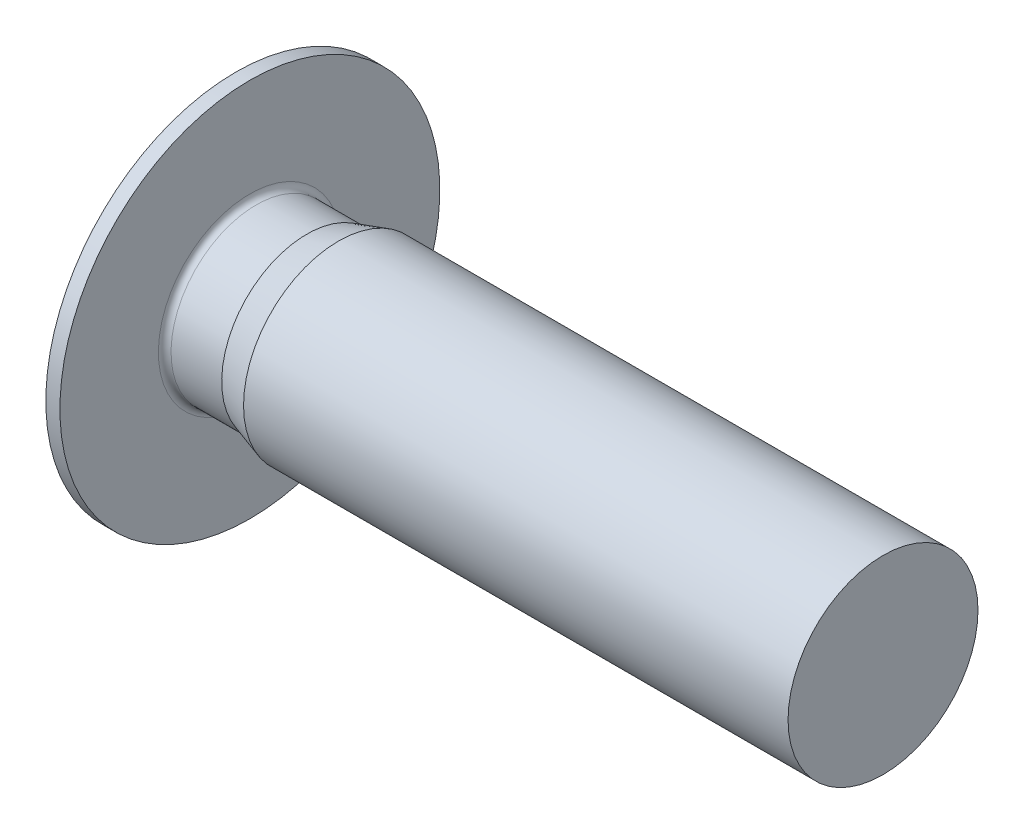
ISO-10303-21;
HEADER;
FILE_DESCRIPTION(('STEP AP214'),'2;1');
FILE_NAME('part.step','',(''),(''),'','','');
FILE_SCHEMA(('AUTOMOTIVE_DESIGN { 1 0 10303 214 1 1 1 1 }'));
ENDSEC;
DATA;
#1=APPLICATION_CONTEXT('core data for automotive mechanical design processes');
#2=APPLICATION_PROTOCOL_DEFINITION('international standard','automotive_design',2000,#1);
#3=PRODUCT_CONTEXT('',#1,'mechanical');
#4=PRODUCT('Part','Part','',(#3));
#5=PRODUCT_RELATED_PRODUCT_CATEGORY('part','',(#4));
#6=PRODUCT_DEFINITION_FORMATION('','',#4);
#7=PRODUCT_DEFINITION_CONTEXT('part definition',#1,'design');
#8=PRODUCT_DEFINITION('design','',#6,#7);
#9=PRODUCT_DEFINITION_SHAPE('','',#8);
#10=(LENGTH_UNIT() NAMED_UNIT(*) SI_UNIT(.MILLI.,.METRE.));
#11=(NAMED_UNIT(*) PLANE_ANGLE_UNIT() SI_UNIT($,.RADIAN.));
#12=(NAMED_UNIT(*) SI_UNIT($,.STERADIAN.) SOLID_ANGLE_UNIT());
#13=UNCERTAINTY_MEASURE_WITH_UNIT(LENGTH_MEASURE(1.E-05),#10,'distance_accuracy_value','');
#14=(GEOMETRIC_REPRESENTATION_CONTEXT(3) GLOBAL_UNCERTAINTY_ASSIGNED_CONTEXT((#13)) GLOBAL_UNIT_ASSIGNED_CONTEXT((#10,
#11,#12)) REPRESENTATION_CONTEXT('',''));
#15=CARTESIAN_POINT('',(0.,0.,0.));
#16=DIRECTION('',(0.,0.,1.));
#17=DIRECTION('',(1.,0.,0.));
#18=AXIS2_PLACEMENT_3D('',#15,#16,#17);
#19=CARTESIAN_POINT('',(1.2,0.,0.));
#20=DIRECTION('',(-1.,0.,0.));
#21=DIRECTION('',(0.,0.,1.));
#22=AXIS2_PLACEMENT_3D('',#19,#20,#21);
#23=PLANE('',#22);
#24=CARTESIAN_POINT('',(1.2,0.,0.));
#25=DIRECTION('',(-1.,0.,0.));
#26=DIRECTION('',(0.,-1.,0.));
#27=AXIS2_PLACEMENT_3D('',#24,#25,#26);
#28=CIRCLE('',#27,0.75);
#29=CARTESIAN_POINT('',(1.2,-0.649519052838329,0.375));
#30=VERTEX_POINT('',#29);
#31=CARTESIAN_POINT('',(1.2,0.,0.75));
#32=VERTEX_POINT('',#31);
#33=EDGE_CURVE('E58',#30,#32,#28,.T.);
#34=ORIENTED_EDGE('',*,*,#33,.F.);
#35=DIRECTION('',(0.,0.5,0.866025403784439));
#36=VECTOR('',#35,1.);
#37=CARTESIAN_POINT('',(1.2,-0.866025403784439,0.));
#38=LINE('',#37,#36);
#39=CARTESIAN_POINT('',(1.2,-0.43301270189222,0.75));
#40=VERTEX_POINT('',#39);
#41=EDGE_CURVE('E309',#30,#40,#38,.T.);
#42=ORIENTED_EDGE('',*,*,#41,.T.);
#43=DIRECTION('',(0.,1.,0.));
#44=VECTOR('',#43,1.);
#45=CARTESIAN_POINT('',(1.2,-0.43301270189222,0.75));
#46=LINE('',#45,#44);
#47=EDGE_CURVE('E261',#40,#32,#46,.T.);
#48=ORIENTED_EDGE('',*,*,#47,.T.);
#49=EDGE_LOOP('',(#34,#42,#48));
#50=FACE_BOUND('',#49,.T.);
#51=ADVANCED_FACE('F46',(#50),#23,.T.);
#52=CARTESIAN_POINT('',(1.2,0.649519052838329,0.375));
#53=VERTEX_POINT('',#52);
#54=EDGE_CURVE('E11',#32,#53,#28,.T.);
#55=ORIENTED_EDGE('',*,*,#54,.F.);
#56=CARTESIAN_POINT('',(1.2,0.43301270189222,0.75));
#57=VERTEX_POINT('',#56);
#58=EDGE_CURVE('E298',#32,#57,#46,.T.);
#59=ORIENTED_EDGE('',*,*,#58,.T.);
#60=DIRECTION('',(0.,0.5,-0.866025403784439));
#61=VECTOR('',#60,1.);
#62=CARTESIAN_POINT('',(1.2,0.43301270189222,0.75));
#63=LINE('',#62,#61);
#64=EDGE_CURVE('E328',#57,#53,#63,.T.);
#65=ORIENTED_EDGE('',*,*,#64,.T.);
#66=EDGE_LOOP('',(#55,#59,#65));
#67=FACE_BOUND('',#66,.T.);
#68=ADVANCED_FACE('F134',(#67),#23,.T.);
#69=CARTESIAN_POINT('',(1.2,0.649519052838329,-0.375));
#70=VERTEX_POINT('',#69);
#71=EDGE_CURVE('E56',#53,#70,#28,.T.);
#72=ORIENTED_EDGE('',*,*,#71,.F.);
#73=CARTESIAN_POINT('',(1.2,0.866025403784439,0.));
#74=VERTEX_POINT('',#73);
#75=EDGE_CURVE('E278',#53,#74,#63,.T.);
#76=ORIENTED_EDGE('',*,*,#75,.T.);
#77=DIRECTION('',(0.,-0.5,-0.866025403784439));
#78=VECTOR('',#77,1.);
#79=CARTESIAN_POINT('',(1.2,0.866025403784439,0.));
#80=LINE('',#79,#78);
#81=EDGE_CURVE('E324',#74,#70,#80,.T.);
#82=ORIENTED_EDGE('',*,*,#81,.T.);
#83=EDGE_LOOP('',(#72,#76,#82));
#84=FACE_BOUND('',#83,.T.);
#85=ADVANCED_FACE('F139',(#84),#23,.T.);
#86=CARTESIAN_POINT('',(1.2,0.,-0.75));
#87=VERTEX_POINT('',#86);
#88=EDGE_CURVE('E247',#70,#87,#28,.T.);
#89=ORIENTED_EDGE('',*,*,#88,.F.);
#90=CARTESIAN_POINT('',(1.2,0.433012701892219,-0.75));
#91=VERTEX_POINT('',#90);
#92=EDGE_CURVE('E327',#70,#91,#80,.T.);
#93=ORIENTED_EDGE('',*,*,#92,.T.);
#94=DIRECTION('',(0.,-1.,0.));
#95=VECTOR('',#94,1.);
#96=CARTESIAN_POINT('',(1.2,0.433012701892219,-0.75));
#97=LINE('',#96,#95);
#98=EDGE_CURVE('E319',#91,#87,#97,.T.);
#99=ORIENTED_EDGE('',*,*,#98,.T.);
#100=EDGE_LOOP('',(#89,#93,#99));
#101=FACE_BOUND('',#100,.T.);
#102=ADVANCED_FACE('F198',(#101),#23,.T.);
#103=CARTESIAN_POINT('',(1.2,-0.649519052838329,-0.375));
#104=VERTEX_POINT('',#103);
#105=EDGE_CURVE('E65',#87,#104,#28,.T.);
#106=ORIENTED_EDGE('',*,*,#105,.F.);
#107=CARTESIAN_POINT('',(1.2,-0.43301270189222,-0.75));
#108=VERTEX_POINT('',#107);
#109=EDGE_CURVE('E323',#87,#108,#97,.T.);
#110=ORIENTED_EDGE('',*,*,#109,.T.);
#111=DIRECTION('',(0.,-0.5,0.866025403784438));
#112=VECTOR('',#111,1.);
#113=CARTESIAN_POINT('',(1.2,-0.43301270189222,-0.75));
#114=LINE('',#113,#112);
#115=EDGE_CURVE('E313',#108,#104,#114,.T.);
#116=ORIENTED_EDGE('',*,*,#115,.T.);
#117=EDGE_LOOP('',(#106,#110,#116));
#118=FACE_BOUND('',#117,.T.);
#119=ADVANCED_FACE('F132',(#118),#23,.T.);
#120=CARTESIAN_POINT('',(-0.8,0.,0.));
#121=DIRECTION('',(-1.,0.,0.));
#122=DIRECTION('',(0.,-1.,0.));
#123=AXIS2_PLACEMENT_3D('',#120,#121,#122);
#124=CYLINDRICAL_SURFACE('',#123,1.345);
#125=CARTESIAN_POINT('',(0.0999999999999999,0.,0.));
#126=DIRECTION('',(-1.,0.,0.));
#127=DIRECTION('',(0.,-1.,0.));
#128=AXIS2_PLACEMENT_3D('',#125,#126,#127);
#129=CIRCLE('',#128,1.345);
#130=CARTESIAN_POINT('',(0.1,-1.345,0.));
#131=VERTEX_POINT('',#130);
#132=EDGE_CURVE('E50',#131,#131,#129,.F.);
#133=ORIENTED_EDGE('',*,*,#132,.T.);
#134=EDGE_LOOP('',(#133));
#135=FACE_BOUND('',#134,.T.);
#136=CARTESIAN_POINT('',(0.9,0.,0.));
#137=DIRECTION('',(-1.,0.,0.));
#138=DIRECTION('',(0.,-1.,0.));
#139=AXIS2_PLACEMENT_3D('',#136,#137,#138);
#140=CIRCLE('',#139,1.345);
#141=CARTESIAN_POINT('',(0.9,-1.345,0.));
#142=VERTEX_POINT('',#141);
#143=EDGE_CURVE('E205',#142,#142,#140,.T.);
#144=ORIENTED_EDGE('',*,*,#143,.T.);
#145=EDGE_LOOP('',(#144));
#146=FACE_BOUND('',#145,.T.);
#147=ADVANCED_FACE('F191',(#135,#146),#124,.T.);
#148=CARTESIAN_POINT('',(0.,3.,0.));
#149=DIRECTION('',(-1.,0.,0.));
#150=DIRECTION('',(0.,-1.,0.));
#151=AXIS2_PLACEMENT_3D('',#148,#149,#150);
#152=PLANE('',#151);
#153=CARTESIAN_POINT('',(0.,0.,0.));
#154=DIRECTION('',(-1.,0.,0.));
#155=DIRECTION('',(0.,-1.,0.));
#156=AXIS2_PLACEMENT_3D('',#153,#154,#155);
#157=CIRCLE('',#156,1.445);
#158=CARTESIAN_POINT('',(0.,-1.445,0.));
#159=VERTEX_POINT('',#158);
#160=EDGE_CURVE('E236',#159,#159,#157,.T.);
#161=ORIENTED_EDGE('',*,*,#160,.T.);
#162=EDGE_LOOP('',(#161));
#163=FACE_BOUND('',#162,.T.);
#164=CARTESIAN_POINT('',(0.,0.,0.));
#165=DIRECTION('',(-1.,0.,0.));
#166=DIRECTION('',(0.,-1.,0.));
#167=AXIS2_PLACEMENT_3D('',#164,#165,#166);
#168=CIRCLE('',#167,3.);
#169=CARTESIAN_POINT('',(0.,-3.,0.));
#170=VERTEX_POINT('',#169);
#171=EDGE_CURVE('E233',#170,#170,#168,.T.);
#172=ORIENTED_EDGE('',*,*,#171,.F.);
#173=EDGE_LOOP('',(#172));
#174=FACE_BOUND('',#173,.T.);
#175=ADVANCED_FACE('F188',(#163,#174),#152,.F.);
#176=CARTESIAN_POINT('',(-0.8,0.,0.));
#177=DIRECTION('',(-1.,0.,0.));
#178=DIRECTION('',(0.,-1.,0.));
#179=AXIS2_PLACEMENT_3D('',#176,#177,#178);
#180=CYLINDRICAL_SURFACE('',#179,3.);
#181=CARTESIAN_POINT('',(-0.222649730810382,0.,0.));
#182=DIRECTION('',(-1.,0.,0.));
#183=DIRECTION('',(0.,-1.,0.));
#184=AXIS2_PLACEMENT_3D('',#181,#182,#183);
#185=CIRCLE('',#184,3.);
#186=CARTESIAN_POINT('',(-0.222649730810382,-3.,0.));
#187=VERTEX_POINT('',#186);
#188=EDGE_CURVE('E229',#187,#187,#185,.T.);
#189=ORIENTED_EDGE('',*,*,#188,.F.);
#190=EDGE_LOOP('',(#189));
#191=FACE_BOUND('',#190,.T.);
#192=ORIENTED_EDGE('',*,*,#171,.T.);
#193=EDGE_LOOP('',(#192));
#194=FACE_BOUND('',#193,.T.);
#195=ADVANCED_FACE('F184',(#191,#194),#180,.T.);
#196=CARTESIAN_POINT('',(-0.222649730810382,0.,0.));
#197=DIRECTION('',(1.,0.,0.));
#198=DIRECTION('',(0.,1.,0.));
#199=AXIS2_PLACEMENT_3D('',#196,#197,#198);
#200=CONICAL_SURFACE('',#199,3.,1.0471975511966);
#201=CARTESIAN_POINT('',(-0.8,0.,0.));
#202=DIRECTION('',(-1.,0.,0.));
#203=DIRECTION('',(0.,-1.,0.));
#204=AXIS2_PLACEMENT_3D('',#201,#202,#203);
#205=CIRCLE('',#204,2.);
#206=CARTESIAN_POINT('',(-0.799999999999999,-2.,0.));
#207=VERTEX_POINT('',#206);
#208=EDGE_CURVE('E225',#207,#207,#205,.T.);
#209=ORIENTED_EDGE('',*,*,#208,.F.);
#210=EDGE_LOOP('',(#209));
#211=FACE_BOUND('',#210,.T.);
#212=ORIENTED_EDGE('',*,*,#188,.T.);
#213=EDGE_LOOP('',(#212));
#214=FACE_BOUND('',#213,.T.);
#215=ADVANCED_FACE('F180',(#211,#214),#200,.T.);
#216=CARTESIAN_POINT('',(-0.8,0.,0.));
#217=DIRECTION('',(1.,0.,0.));
#218=DIRECTION('',(0.,1.,0.));
#219=AXIS2_PLACEMENT_3D('',#216,#217,#218);
#220=PLANE('',#219);
#221=DIRECTION('',(0.,-0.5,-0.866025403784439));
#222=VECTOR('',#221,1.);
#223=CARTESIAN_POINT('',(-0.8,0.866025403784439,0.));
#224=LINE('',#223,#222);
#225=CARTESIAN_POINT('',(-0.8,0.866025403784439,0.));
#226=VERTEX_POINT('',#225);
#227=CARTESIAN_POINT('',(-0.8,0.433012701892219,-0.75));
#228=VERTEX_POINT('',#227);
#229=EDGE_CURVE('E253',#226,#228,#224,.T.);
#230=ORIENTED_EDGE('',*,*,#229,.F.);
#231=DIRECTION('',(0.,0.5,-0.866025403784439));
#232=VECTOR('',#231,1.);
#233=CARTESIAN_POINT('',(-0.8,0.43301270189222,0.75));
#234=LINE('',#233,#232);
#235=CARTESIAN_POINT('',(-0.8,0.43301270189222,0.75));
#236=VERTEX_POINT('',#235);
#237=EDGE_CURVE('E73',#236,#226,#234,.T.);
#238=ORIENTED_EDGE('',*,*,#237,.F.);
#239=DIRECTION('',(0.,1.,0.));
#240=VECTOR('',#239,1.);
#241=CARTESIAN_POINT('',(-0.8,-0.43301270189222,0.75));
#242=LINE('',#241,#240);
#243=CARTESIAN_POINT('',(-0.8,-0.43301270189222,0.75));
#244=VERTEX_POINT('',#243);
#245=EDGE_CURVE('E275',#244,#236,#242,.T.);
#246=ORIENTED_EDGE('',*,*,#245,.F.);
#247=DIRECTION('',(0.,0.5,0.866025403784439));
#248=VECTOR('',#247,1.);
#249=CARTESIAN_POINT('',(-0.8,-0.866025403784439,0.));
#250=LINE('',#249,#248);
#251=CARTESIAN_POINT('',(-0.8,-0.866025403784439,0.));
#252=VERTEX_POINT('',#251);
#253=EDGE_CURVE('E271',#252,#244,#250,.T.);
#254=ORIENTED_EDGE('',*,*,#253,.F.);
#255=DIRECTION('',(0.,-0.5,0.866025403784438));
#256=VECTOR('',#255,1.);
#257=CARTESIAN_POINT('',(-0.8,-0.43301270189222,-0.75));
#258=LINE('',#257,#256);
#259=CARTESIAN_POINT('',(-0.8,-0.43301270189222,-0.75));
#260=VERTEX_POINT('',#259);
#261=EDGE_CURVE('E267',#260,#252,#258,.T.);
#262=ORIENTED_EDGE('',*,*,#261,.F.);
#263=DIRECTION('',(0.,-1.,0.));
#264=VECTOR('',#263,1.);
#265=CARTESIAN_POINT('',(-0.8,0.433012701892219,-0.75));
#266=LINE('',#265,#264);
#267=EDGE_CURVE('E258',#228,#260,#266,.T.);
#268=ORIENTED_EDGE('',*,*,#267,.F.);
#269=EDGE_LOOP('',(#230,#238,#246,#254,#262,#268));
#270=FACE_BOUND('',#269,.T.);
#271=ORIENTED_EDGE('',*,*,#208,.T.);
#272=EDGE_LOOP('',(#271));
#273=FACE_BOUND('',#272,.T.);
#274=ADVANCED_FACE('F176',(#270,#273),#220,.F.);
#275=CARTESIAN_POINT('',(10.,1.5,0.));
#276=DIRECTION('',(-1.,0.,0.));
#277=DIRECTION('',(0.,-1.,0.));
#278=AXIS2_PLACEMENT_3D('',#275,#276,#277);
#279=PLANE('',#278);
#280=CARTESIAN_POINT('',(10.,0.,0.));
#281=DIRECTION('',(-1.,0.,0.));
#282=DIRECTION('',(0.,-1.,0.));
#283=AXIS2_PLACEMENT_3D('',#280,#281,#282);
#284=CIRCLE('',#283,1.5);
#285=CARTESIAN_POINT('',(10.,-1.5,0.));
#286=VERTEX_POINT('',#285);
#287=EDGE_CURVE('E214',#286,#286,#284,.T.);
#288=ORIENTED_EDGE('',*,*,#287,.F.);
#289=EDGE_LOOP('',(#288));
#290=FACE_BOUND('',#289,.T.);
#291=ADVANCED_FACE('F172',(#290),#279,.F.);
#292=CARTESIAN_POINT('',(-0.8,0.,0.));
#293=DIRECTION('',(-1.,0.,0.));
#294=DIRECTION('',(0.,-1.,0.));
#295=AXIS2_PLACEMENT_3D('',#292,#293,#294);
#296=CYLINDRICAL_SURFACE('',#295,1.5);
#297=CARTESIAN_POINT('',(1.4,0.,0.));
#298=DIRECTION('',(-1.,0.,0.));
#299=DIRECTION('',(0.,-1.,0.));
#300=AXIS2_PLACEMENT_3D('',#297,#298,#299);
#301=CIRCLE('',#300,1.5);
#302=CARTESIAN_POINT('',(1.4,-1.5,0.));
#303=VERTEX_POINT('',#302);
#304=EDGE_CURVE('E207',#303,#303,#301,.T.);
#305=ORIENTED_EDGE('',*,*,#304,.F.);
#306=EDGE_LOOP('',(#305));
#307=FACE_BOUND('',#306,.T.);
#308=ORIENTED_EDGE('',*,*,#287,.T.);
#309=EDGE_LOOP('',(#308));
#310=FACE_BOUND('',#309,.T.);
#311=ADVANCED_FACE('F168',(#307,#310),#296,.T.);
#312=CARTESIAN_POINT('',(1.4,0.,0.));
#313=DIRECTION('',(1.,0.,0.));
#314=DIRECTION('',(0.,1.,0.));
#315=AXIS2_PLACEMENT_3D('',#312,#313,#314);
#316=CONICAL_SURFACE('',#315,1.5,0.300605670042395);
#317=ORIENTED_EDGE('',*,*,#143,.F.);
#318=EDGE_LOOP('',(#317));
#319=FACE_BOUND('',#318,.T.);
#320=ORIENTED_EDGE('',*,*,#304,.T.);
#321=EDGE_LOOP('',(#320));
#322=FACE_BOUND('',#321,.T.);
#323=ADVANCED_FACE('F165',(#319,#322),#316,.T.);
#324=CARTESIAN_POINT('',(0.1,0.,0.));
#325=DIRECTION('',(-1.,0.,0.));
#326=DIRECTION('',(0.,-1.,0.));
#327=AXIS2_PLACEMENT_3D('',#324,#325,#326);
#328=TOROIDAL_SURFACE('',#327,1.445,0.1);
#329=ORIENTED_EDGE('',*,*,#132,.F.);
#330=EDGE_LOOP('',(#329));
#331=FACE_BOUND('',#330,.T.);
#332=ORIENTED_EDGE('',*,*,#160,.F.);
#333=EDGE_LOOP('',(#332));
#334=FACE_BOUND('',#333,.T.);
#335=ADVANCED_FACE('F48',(#331,#334),#328,.F.);
#336=CARTESIAN_POINT('',(1.2,0.43301270189222,0.75));
#337=DIRECTION('',(0.,0.866025403784439,0.5));
#338=DIRECTION('',(0.,-0.5,0.866025403784439));
#339=AXIS2_PLACEMENT_3D('',#336,#337,#338);
#340=PLANE('',#339);
#341=ORIENTED_EDGE('',*,*,#237,.T.);
#342=DIRECTION('',(-1.,0.,0.));
#343=VECTOR('',#342,1.);
#344=CARTESIAN_POINT('',(1.2,0.866025403784439,0.));
#345=LINE('',#344,#343);
#346=EDGE_CURVE('E219',#74,#226,#345,.T.);
#347=ORIENTED_EDGE('',*,*,#346,.F.);
#348=ORIENTED_EDGE('',*,*,#75,.F.);
#349=ORIENTED_EDGE('',*,*,#64,.F.);
#350=DIRECTION('',(-1.,0.,0.));
#351=VECTOR('',#350,1.);
#352=CARTESIAN_POINT('',(1.2,0.43301270189222,0.75));
#353=LINE('',#352,#351);
#354=EDGE_CURVE('E208',#57,#236,#353,.T.);
#355=ORIENTED_EDGE('',*,*,#354,.T.);
#356=EDGE_LOOP('',(#341,#347,#348,#349,#355));
#357=FACE_BOUND('',#356,.T.);
#358=ADVANCED_FACE('F147',(#357),#340,.F.);
#359=CARTESIAN_POINT('',(1.2,-0.43301270189222,0.75));
#360=DIRECTION('',(0.,0.,1.));
#361=DIRECTION('',(0.,-1.,0.));
#362=AXIS2_PLACEMENT_3D('',#359,#360,#361);
#363=PLANE('',#362);
#364=ORIENTED_EDGE('',*,*,#245,.T.);
#365=ORIENTED_EDGE('',*,*,#354,.F.);
#366=ORIENTED_EDGE('',*,*,#58,.F.);
#367=ORIENTED_EDGE('',*,*,#47,.F.);
#368=DIRECTION('',(-1.,0.,0.));
#369=VECTOR('',#368,1.);
#370=CARTESIAN_POINT('',(1.2,-0.43301270189222,0.75));
#371=LINE('',#370,#369);
#372=EDGE_CURVE('E216',#40,#244,#371,.T.);
#373=ORIENTED_EDGE('',*,*,#372,.T.);
#374=EDGE_LOOP('',(#364,#365,#366,#367,#373));
#375=FACE_BOUND('',#374,.T.);
#376=ADVANCED_FACE('F143',(#375),#363,.F.);
#377=CARTESIAN_POINT('',(1.2,-0.866025403784439,0.));
#378=DIRECTION('',(0.,-0.866025403784439,0.5));
#379=DIRECTION('',(0.,-0.5,-0.866025403784439));
#380=AXIS2_PLACEMENT_3D('',#377,#378,#379);
#381=PLANE('',#380);
#382=ORIENTED_EDGE('',*,*,#253,.T.);
#383=ORIENTED_EDGE('',*,*,#372,.F.);
#384=ORIENTED_EDGE('',*,*,#41,.F.);
#385=CARTESIAN_POINT('',(1.2,-0.866025403784439,0.));
#386=VERTEX_POINT('',#385);
#387=EDGE_CURVE('E302',#386,#30,#38,.T.);
#388=ORIENTED_EDGE('',*,*,#387,.F.);
#389=DIRECTION('',(-1.,0.,0.));
#390=VECTOR('',#389,1.);
#391=CARTESIAN_POINT('',(1.2,-0.866025403784439,0.));
#392=LINE('',#391,#390);
#393=EDGE_CURVE('E282',#386,#252,#392,.T.);
#394=ORIENTED_EDGE('',*,*,#393,.T.);
#395=EDGE_LOOP('',(#382,#383,#384,#388,#394));
#396=FACE_BOUND('',#395,.T.);
#397=ADVANCED_FACE('F146',(#396),#381,.F.);
#398=CARTESIAN_POINT('',(1.2,-0.43301270189222,-0.75));
#399=DIRECTION('',(0.,-0.866025403784439,-0.5));
#400=DIRECTION('',(0.,0.5,-0.866025403784439));
#401=AXIS2_PLACEMENT_3D('',#398,#399,#400);
#402=PLANE('',#401);
#403=ORIENTED_EDGE('',*,*,#261,.T.);
#404=ORIENTED_EDGE('',*,*,#393,.F.);
#405=EDGE_CURVE('E318',#104,#386,#114,.T.);
#406=ORIENTED_EDGE('',*,*,#405,.F.);
#407=ORIENTED_EDGE('',*,*,#115,.F.);
#408=DIRECTION('',(-1.,0.,0.));
#409=VECTOR('',#408,1.);
#410=CARTESIAN_POINT('',(1.2,-0.43301270189222,-0.75));
#411=LINE('',#410,#409);
#412=EDGE_CURVE('E285',#108,#260,#411,.T.);
#413=ORIENTED_EDGE('',*,*,#412,.T.);
#414=EDGE_LOOP('',(#403,#404,#406,#407,#413));
#415=FACE_BOUND('',#414,.T.);
#416=ADVANCED_FACE('F151',(#415),#402,.F.);
#417=CARTESIAN_POINT('',(1.2,0.433012701892219,-0.75));
#418=DIRECTION('',(0.,0.,-1.));
#419=DIRECTION('',(-1.,0.,0.));
#420=AXIS2_PLACEMENT_3D('',#417,#418,#419);
#421=PLANE('',#420);
#422=ORIENTED_EDGE('',*,*,#267,.T.);
#423=ORIENTED_EDGE('',*,*,#412,.F.);
#424=ORIENTED_EDGE('',*,*,#109,.F.);
#425=ORIENTED_EDGE('',*,*,#98,.F.);
#426=DIRECTION('',(-1.,0.,0.));
#427=VECTOR('',#426,1.);
#428=CARTESIAN_POINT('',(1.2,0.433012701892219,-0.75));
#429=LINE('',#428,#427);
#430=EDGE_CURVE('E287',#91,#228,#429,.T.);
#431=ORIENTED_EDGE('',*,*,#430,.T.);
#432=EDGE_LOOP('',(#422,#423,#424,#425,#431));
#433=FACE_BOUND('',#432,.T.);
#434=ADVANCED_FACE('F155',(#433),#421,.F.);
#435=CARTESIAN_POINT('',(1.2,0.866025403784439,0.));
#436=DIRECTION('',(0.,0.866025403784439,-0.5));
#437=DIRECTION('',(0.,0.5,0.866025403784439));
#438=AXIS2_PLACEMENT_3D('',#435,#436,#437);
#439=PLANE('',#438);
#440=ORIENTED_EDGE('',*,*,#229,.T.);
#441=ORIENTED_EDGE('',*,*,#430,.F.);
#442=ORIENTED_EDGE('',*,*,#92,.F.);
#443=ORIENTED_EDGE('',*,*,#81,.F.);
#444=ORIENTED_EDGE('',*,*,#346,.T.);
#445=EDGE_LOOP('',(#440,#441,#442,#443,#444));
#446=FACE_BOUND('',#445,.T.);
#447=ADVANCED_FACE('F129',(#446),#439,.F.);
#448=EDGE_CURVE('E242',#104,#30,#28,.T.);
#449=ORIENTED_EDGE('',*,*,#448,.F.);
#450=ORIENTED_EDGE('',*,*,#405,.T.);
#451=ORIENTED_EDGE('',*,*,#387,.T.);
#452=EDGE_LOOP('',(#449,#450,#451));
#453=FACE_BOUND('',#452,.T.);
#454=ADVANCED_FACE('F124',(#453),#23,.T.);
#455=CARTESIAN_POINT('',(1.65064546427067,0.,0.));
#456=DIRECTION('',(-1.,0.,0.));
#457=DIRECTION('',(0.,-1.,0.));
#458=AXIS2_PLACEMENT_3D('',#455,#456,#457);
#459=CONICAL_SURFACE('',#458,0.,1.02974425867666);
#460=ORIENTED_EDGE('',*,*,#33,.T.);
#461=ORIENTED_EDGE('',*,*,#54,.T.);
#462=ORIENTED_EDGE('',*,*,#71,.T.);
#463=ORIENTED_EDGE('',*,*,#88,.T.);
#464=ORIENTED_EDGE('',*,*,#105,.T.);
#465=ORIENTED_EDGE('',*,*,#448,.T.);
#466=EDGE_LOOP('',(#460,#461,#462,#463,#464,#465));
#467=FACE_BOUND('',#466,.T.);
#468=CARTESIAN_POINT('',(1.65064546427067,0.,0.));
#469=VERTEX_POINT('',#468);
#470=VERTEX_LOOP('',#469);
#471=FACE_BOUND('',#470,.T.);
#472=ADVANCED_FACE('F122',(#467,#471),#459,.F.);
#473=CLOSED_SHELL('',(#51,#68,#85,#102,#119,#147,#175,#195,#215,#274,#291,#311,#323,#335,#358,
#376,#397,#416,#434,#447,#454,#472));
#474=MANIFOLD_SOLID_BREP('B2',#473);
#475=ADVANCED_BREP_SHAPE_REPRESENTATION('',(#18,#474),#14);
#476=SHAPE_DEFINITION_REPRESENTATION(#9,#475);
ENDSEC;
END-ISO-10303-21;
